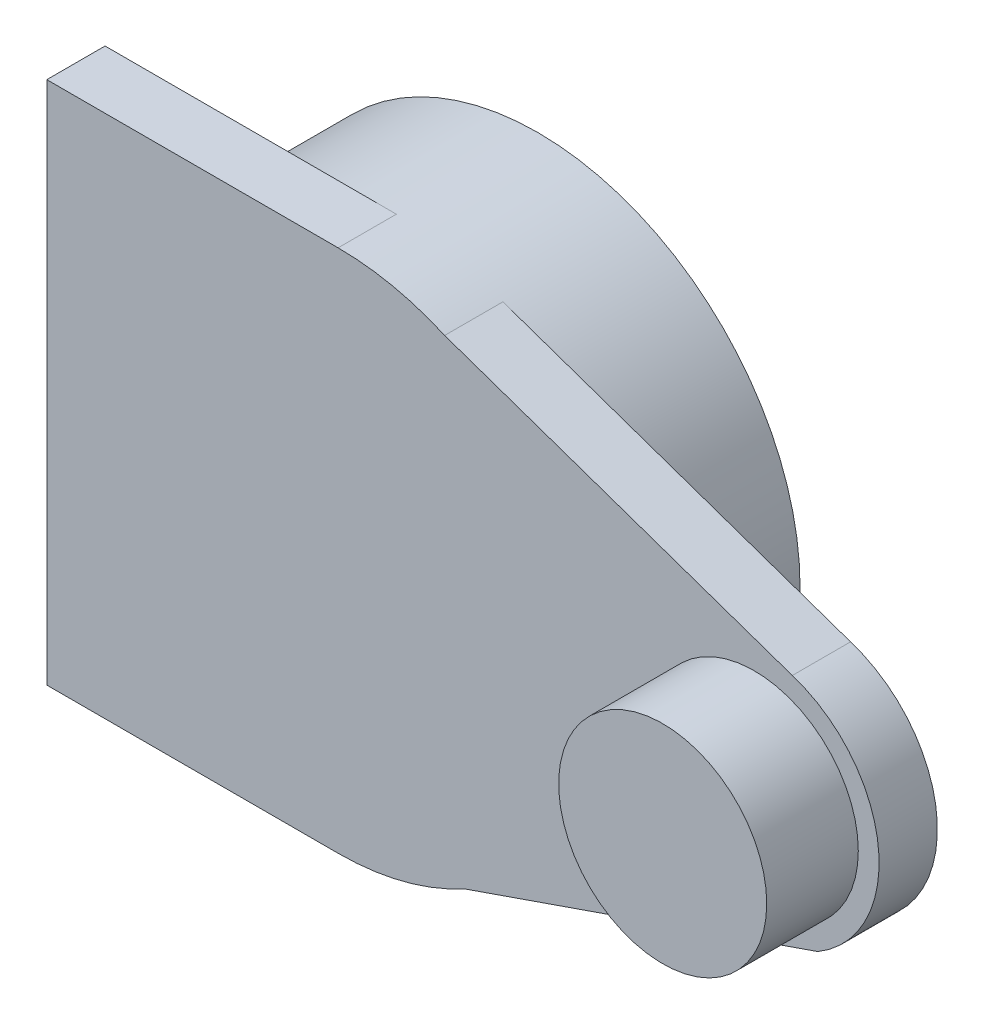
ISO-10303-21;
HEADER;
FILE_DESCRIPTION(('STEP AP214'),'2;1');
FILE_NAME('part.step','',(''),(''),'','','');
FILE_SCHEMA(('AUTOMOTIVE_DESIGN { 1 0 10303 214 1 1 1 1 }'));
ENDSEC;
DATA;
#1=APPLICATION_CONTEXT('core data for automotive mechanical design processes');
#2=APPLICATION_PROTOCOL_DEFINITION('international standard','automotive_design',2000,#1);
#3=PRODUCT_CONTEXT('',#1,'mechanical');
#4=PRODUCT('Part','Part','',(#3));
#5=PRODUCT_RELATED_PRODUCT_CATEGORY('part','',(#4));
#6=PRODUCT_DEFINITION_FORMATION('','',#4);
#7=PRODUCT_DEFINITION_CONTEXT('part definition',#1,'design');
#8=PRODUCT_DEFINITION('design','',#6,#7);
#9=PRODUCT_DEFINITION_SHAPE('','',#8);
#10=(LENGTH_UNIT() NAMED_UNIT(*) SI_UNIT(.MILLI.,.METRE.));
#11=(NAMED_UNIT(*) PLANE_ANGLE_UNIT() SI_UNIT($,.RADIAN.));
#12=(NAMED_UNIT(*) SI_UNIT($,.STERADIAN.) SOLID_ANGLE_UNIT());
#13=UNCERTAINTY_MEASURE_WITH_UNIT(LENGTH_MEASURE(1.E-05),#10,'distance_accuracy_value','');
#14=(GEOMETRIC_REPRESENTATION_CONTEXT(3) GLOBAL_UNCERTAINTY_ASSIGNED_CONTEXT((#13)) GLOBAL_UNIT_ASSIGNED_CONTEXT((#10,
#11,#12)) REPRESENTATION_CONTEXT('',''));
#15=CARTESIAN_POINT('',(0.,0.,0.));
#16=DIRECTION('',(0.,0.,1.));
#17=DIRECTION('',(1.,0.,0.));
#18=AXIS2_PLACEMENT_3D('',#15,#16,#17);
#19=CARTESIAN_POINT('',(0.,0.,17.));
#20=DIRECTION('',(0.,0.,-1.));
#21=DIRECTION('',(-1.,0.,0.));
#22=AXIS2_PLACEMENT_3D('',#19,#20,#21);
#23=CYLINDRICAL_SURFACE('',#22,31.5);
#24=CARTESIAN_POINT('',(0.,0.,17.));
#25=DIRECTION('',(0.,0.,1.));
#26=DIRECTION('',(1.,0.,0.));
#27=AXIS2_PLACEMENT_3D('',#24,#25,#26);
#28=CIRCLE('',#27,31.5);
#29=CARTESIAN_POINT('',(0.,31.5,17.));
#30=VERTEX_POINT('',#29);
#31=CARTESIAN_POINT('',(0.,-31.5,17.));
#32=VERTEX_POINT('',#31);
#33=EDGE_CURVE('E11',#30,#32,#28,.T.);
#34=ORIENTED_EDGE('',*,*,#33,.F.);
#35=DIRECTION('',(0.,0.,-1.));
#36=VECTOR('',#35,1.);
#37=CARTESIAN_POINT('',(0.,31.5,24.));
#38=LINE('',#37,#36);
#39=CARTESIAN_POINT('',(0.,31.5,24.));
#40=VERTEX_POINT('',#39);
#41=EDGE_CURVE('E151',#40,#30,#38,.T.);
#42=ORIENTED_EDGE('',*,*,#41,.F.);
#43=CARTESIAN_POINT('',(0.,0.,24.));
#44=DIRECTION('',(0.,0.,1.));
#45=DIRECTION('',(1.,0.,0.));
#46=AXIS2_PLACEMENT_3D('',#43,#44,#45);
#47=CIRCLE('',#46,31.5);
#48=CARTESIAN_POINT('',(12.8013934156946,28.7814927795035,24.));
#49=VERTEX_POINT('',#48);
#50=EDGE_CURVE('E130',#49,#40,#47,.T.);
#51=ORIENTED_EDGE('',*,*,#50,.F.);
#52=DIRECTION('',(0.,0.,-1.));
#53=VECTOR('',#52,1.);
#54=CARTESIAN_POINT('',(12.8013934156946,28.7814927795035,24.));
#55=LINE('',#54,#53);
#56=CARTESIAN_POINT('',(12.8013934156946,28.7814927795035,17.));
#57=VERTEX_POINT('',#56);
#58=EDGE_CURVE('E154',#49,#57,#55,.T.);
#59=ORIENTED_EDGE('',*,*,#58,.T.);
#60=CARTESIAN_POINT('',(15.1228498735212,-27.6323978637928,17.));
#61=VERTEX_POINT('',#60);
#62=EDGE_CURVE('E42',#61,#57,#28,.T.);
#63=ORIENTED_EDGE('',*,*,#62,.F.);
#64=DIRECTION('',(0.,0.,-1.));
#65=VECTOR('',#64,1.);
#66=CARTESIAN_POINT('',(15.1228498735212,-27.6323978637928,24.));
#67=LINE('',#66,#65);
#68=CARTESIAN_POINT('',(15.1228498735212,-27.6323978637928,24.));
#69=VERTEX_POINT('',#68);
#70=EDGE_CURVE('E161',#69,#61,#67,.T.);
#71=ORIENTED_EDGE('',*,*,#70,.F.);
#72=CARTESIAN_POINT('',(0.,-31.5,24.));
#73=VERTEX_POINT('',#72);
#74=EDGE_CURVE('E115',#73,#69,#47,.T.);
#75=ORIENTED_EDGE('',*,*,#74,.F.);
#76=DIRECTION('',(0.,0.,-1.));
#77=VECTOR('',#76,1.);
#78=CARTESIAN_POINT('',(0.,-31.5,24.));
#79=LINE('',#78,#77);
#80=EDGE_CURVE('E107',#73,#32,#79,.T.);
#81=ORIENTED_EDGE('',*,*,#80,.T.);
#82=EDGE_LOOP('',(#34,#42,#51,#59,#63,#71,#75,#81));
#83=FACE_BOUND('',#82,.T.);
#84=CARTESIAN_POINT('',(0.,0.,0.));
#85=DIRECTION('',(0.,0.,1.));
#86=DIRECTION('',(1.,0.,0.));
#87=AXIS2_PLACEMENT_3D('',#84,#85,#86);
#88=CIRCLE('',#87,31.5);
#89=CARTESIAN_POINT('',(31.5,0.,0.));
#90=VERTEX_POINT('',#89);
#91=EDGE_CURVE('E37',#90,#90,#88,.T.);
#92=ORIENTED_EDGE('',*,*,#91,.T.);
#93=EDGE_LOOP('',(#92));
#94=FACE_BOUND('',#93,.T.);
#95=ADVANCED_FACE('F34',(#83,#94),#23,.T.);
#96=CARTESIAN_POINT('',(0.,0.,0.));
#97=DIRECTION('',(0.,0.,1.));
#98=DIRECTION('',(1.,0.,0.));
#99=AXIS2_PLACEMENT_3D('',#96,#97,#98);
#100=PLANE('',#99);
#101=ORIENTED_EDGE('',*,*,#91,.F.);
#102=EDGE_LOOP('',(#101));
#103=FACE_BOUND('',#102,.T.);
#104=ADVANCED_FACE('F169',(#103),#100,.F.);
#105=CARTESIAN_POINT('',(0.,0.,17.));
#106=DIRECTION('',(0.,0.,1.));
#107=DIRECTION('',(1.,0.,0.));
#108=AXIS2_PLACEMENT_3D('',#105,#106,#107);
#109=PLANE('',#108);
#110=DIRECTION('',(1.,0.,0.));
#111=VECTOR('',#110,1.);
#112=CARTESIAN_POINT('',(0.,31.5,17.));
#113=LINE('',#112,#111);
#114=CARTESIAN_POINT('',(-35.,31.5,17.));
#115=VERTEX_POINT('',#114);
#116=EDGE_CURVE('E120',#115,#30,#113,.T.);
#117=ORIENTED_EDGE('',*,*,#116,.T.);
#118=ORIENTED_EDGE('',*,*,#33,.T.);
#119=DIRECTION('',(1.,0.,0.));
#120=VECTOR('',#119,1.);
#121=CARTESIAN_POINT('',(0.,-31.5,17.));
#122=LINE('',#121,#120);
#123=CARTESIAN_POINT('',(-35.,-31.5,17.));
#124=VERTEX_POINT('',#123);
#125=EDGE_CURVE('E140',#124,#32,#122,.T.);
#126=ORIENTED_EDGE('',*,*,#125,.F.);
#127=DIRECTION('',(0.,1.,0.));
#128=VECTOR('',#127,1.);
#129=CARTESIAN_POINT('',(-35.,0.,17.));
#130=LINE('',#129,#128);
#131=EDGE_CURVE('E105',#124,#115,#130,.T.);
#132=ORIENTED_EDGE('',*,*,#131,.T.);
#133=EDGE_LOOP('',(#117,#118,#126,#132));
#134=FACE_BOUND('',#133,.T.);
#135=ADVANCED_FACE('F171',(#134),#109,.F.);
#136=DIRECTION('',(0.944935564811964,0.327256441271207,0.));
#137=VECTOR('',#136,1.);
#138=CARTESIAN_POINT('',(10.164547599609,-29.3495904611847,17.));
#139=LINE('',#138,#137);
#140=CARTESIAN_POINT('',(57.6439366912385,-12.9062090429505,17.));
#141=VERTEX_POINT('',#140);
#142=EDGE_CURVE('E143',#61,#141,#139,.T.);
#143=ORIENTED_EDGE('',*,*,#142,.F.);
#144=ORIENTED_EDGE('',*,*,#62,.T.);
#145=DIRECTION('',(0.944732313874652,-0.327842729248412,0.));
#146=VECTOR('',#145,1.);
#147=CARTESIAN_POINT('',(10.2902128491951,29.6529272360854,17.));
#148=LINE('',#147,#146);
#149=CARTESIAN_POINT('',(54.5696027128904,14.2870126704761,17.));
#150=VERTEX_POINT('',#149);
#151=EDGE_CURVE('E122',#57,#150,#148,.T.);
#152=ORIENTED_EDGE('',*,*,#151,.T.);
#153=CARTESIAN_POINT('',(50.,0.,17.));
#154=DIRECTION('',(0.,0.,1.));
#155=DIRECTION('',(1.,0.,0.));
#156=AXIS2_PLACEMENT_3D('',#153,#154,#155);
#157=CIRCLE('',#156,15.);
#158=EDGE_CURVE('E145',#141,#150,#157,.T.);
#159=ORIENTED_EDGE('',*,*,#158,.F.);
#160=EDGE_LOOP('',(#143,#144,#152,#159));
#161=FACE_BOUND('',#160,.T.);
#162=ADVANCED_FACE('F176',(#161),#109,.F.);
#163=CARTESIAN_POINT('',(-35.,0.,24.));
#164=DIRECTION('',(-1.,0.,0.));
#165=DIRECTION('',(0.,0.,1.));
#166=AXIS2_PLACEMENT_3D('',#163,#164,#165);
#167=PLANE('',#166);
#168=ORIENTED_EDGE('',*,*,#131,.F.);
#169=DIRECTION('',(0.,0.,-1.));
#170=VECTOR('',#169,1.);
#171=CARTESIAN_POINT('',(-35.,-31.5,24.));
#172=LINE('',#171,#170);
#173=CARTESIAN_POINT('',(-35.,-31.5,24.));
#174=VERTEX_POINT('',#173);
#175=EDGE_CURVE('E98',#174,#124,#172,.T.);
#176=ORIENTED_EDGE('',*,*,#175,.F.);
#177=DIRECTION('',(0.,1.,0.));
#178=VECTOR('',#177,1.);
#179=CARTESIAN_POINT('',(-35.,0.,24.));
#180=LINE('',#179,#178);
#181=CARTESIAN_POINT('',(-35.,31.5,24.));
#182=VERTEX_POINT('',#181);
#183=EDGE_CURVE('E102',#174,#182,#180,.T.);
#184=ORIENTED_EDGE('',*,*,#183,.T.);
#185=DIRECTION('',(0.,0.,-1.));
#186=VECTOR('',#185,1.);
#187=CARTESIAN_POINT('',(-35.,31.5,24.));
#188=LINE('',#187,#186);
#189=EDGE_CURVE('E138',#182,#115,#188,.T.);
#190=ORIENTED_EDGE('',*,*,#189,.T.);
#191=EDGE_LOOP('',(#168,#176,#184,#190));
#192=FACE_BOUND('',#191,.T.);
#193=ADVANCED_FACE('F100',(#192),#167,.T.);
#194=CARTESIAN_POINT('',(0.,-31.5,24.));
#195=DIRECTION('',(0.,1.,0.));
#196=DIRECTION('',(-1.,0.,0.));
#197=AXIS2_PLACEMENT_3D('',#194,#195,#196);
#198=PLANE('',#197);
#199=ORIENTED_EDGE('',*,*,#125,.T.);
#200=ORIENTED_EDGE('',*,*,#80,.F.);
#201=DIRECTION('',(1.,0.,0.));
#202=VECTOR('',#201,1.);
#203=CARTESIAN_POINT('',(0.,-31.5,24.));
#204=LINE('',#203,#202);
#205=EDGE_CURVE('E110',#174,#73,#204,.T.);
#206=ORIENTED_EDGE('',*,*,#205,.F.);
#207=ORIENTED_EDGE('',*,*,#175,.T.);
#208=EDGE_LOOP('',(#199,#200,#206,#207));
#209=FACE_BOUND('',#208,.T.);
#210=ADVANCED_FACE('F111',(#209),#198,.F.);
#211=CARTESIAN_POINT('',(10.164547599609,-29.3495904611847,24.));
#212=DIRECTION('',(-0.327256441271207,0.944935564811964,0.));
#213=DIRECTION('',(-0.944935564811964,-0.327256441271207,0.));
#214=AXIS2_PLACEMENT_3D('',#211,#212,#213);
#215=PLANE('',#214);
#216=ORIENTED_EDGE('',*,*,#142,.T.);
#217=DIRECTION('',(0.,0.,-1.));
#218=VECTOR('',#217,1.);
#219=CARTESIAN_POINT('',(57.6439366912385,-12.9062090429505,24.));
#220=LINE('',#219,#218);
#221=CARTESIAN_POINT('',(57.6439366912385,-12.9062090429505,24.));
#222=VERTEX_POINT('',#221);
#223=EDGE_CURVE('E158',#222,#141,#220,.T.);
#224=ORIENTED_EDGE('',*,*,#223,.F.);
#225=DIRECTION('',(0.944935564811964,0.327256441271207,0.));
#226=VECTOR('',#225,1.);
#227=CARTESIAN_POINT('',(10.164547599609,-29.3495904611847,24.));
#228=LINE('',#227,#226);
#229=EDGE_CURVE('E129',#69,#222,#228,.T.);
#230=ORIENTED_EDGE('',*,*,#229,.F.);
#231=ORIENTED_EDGE('',*,*,#70,.T.);
#232=EDGE_LOOP('',(#216,#224,#230,#231));
#233=FACE_BOUND('',#232,.T.);
#234=ADVANCED_FACE('F183',(#233),#215,.F.);
#235=CARTESIAN_POINT('',(50.,0.,24.));
#236=DIRECTION('',(0.,0.,-1.));
#237=DIRECTION('',(-1.,0.,0.));
#238=AXIS2_PLACEMENT_3D('',#235,#236,#237);
#239=CYLINDRICAL_SURFACE('',#238,15.);
#240=ORIENTED_EDGE('',*,*,#158,.T.);
#241=DIRECTION('',(0.,0.,-1.));
#242=VECTOR('',#241,1.);
#243=CARTESIAN_POINT('',(54.5696027128904,14.2870126704761,24.));
#244=LINE('',#243,#242);
#245=CARTESIAN_POINT('',(54.5696027128904,14.2870126704761,24.));
#246=VERTEX_POINT('',#245);
#247=EDGE_CURVE('E156',#246,#150,#244,.T.);
#248=ORIENTED_EDGE('',*,*,#247,.F.);
#249=CARTESIAN_POINT('',(50.,0.,24.));
#250=DIRECTION('',(0.,0.,1.));
#251=DIRECTION('',(1.,0.,0.));
#252=AXIS2_PLACEMENT_3D('',#249,#250,#251);
#253=CIRCLE('',#252,15.);
#254=EDGE_CURVE('E132',#222,#246,#253,.T.);
#255=ORIENTED_EDGE('',*,*,#254,.F.);
#256=ORIENTED_EDGE('',*,*,#223,.T.);
#257=EDGE_LOOP('',(#240,#248,#255,#256));
#258=FACE_BOUND('',#257,.T.);
#259=ADVANCED_FACE('F186',(#258),#239,.T.);
#260=CARTESIAN_POINT('',(10.2902128491951,29.6529272360854,24.));
#261=DIRECTION('',(0.327842729248412,0.944732313874651,0.));
#262=DIRECTION('',(-0.944732313874651,0.327842729248412,0.));
#263=AXIS2_PLACEMENT_3D('',#260,#261,#262);
#264=PLANE('',#263);
#265=ORIENTED_EDGE('',*,*,#151,.F.);
#266=ORIENTED_EDGE('',*,*,#58,.F.);
#267=DIRECTION('',(0.944732313874652,-0.327842729248412,0.));
#268=VECTOR('',#267,1.);
#269=CARTESIAN_POINT('',(10.2902128491951,29.6529272360854,24.));
#270=LINE('',#269,#268);
#271=EDGE_CURVE('E134',#49,#246,#270,.T.);
#272=ORIENTED_EDGE('',*,*,#271,.T.);
#273=ORIENTED_EDGE('',*,*,#247,.T.);
#274=EDGE_LOOP('',(#265,#266,#272,#273));
#275=FACE_BOUND('',#274,.T.);
#276=ADVANCED_FACE('F190',(#275),#264,.T.);
#277=CARTESIAN_POINT('',(0.,31.5,24.));
#278=DIRECTION('',(0.,1.,0.));
#279=DIRECTION('',(-1.,0.,0.));
#280=AXIS2_PLACEMENT_3D('',#277,#278,#279);
#281=PLANE('',#280);
#282=ORIENTED_EDGE('',*,*,#116,.F.);
#283=ORIENTED_EDGE('',*,*,#189,.F.);
#284=DIRECTION('',(1.,0.,0.));
#285=VECTOR('',#284,1.);
#286=CARTESIAN_POINT('',(0.,31.5,24.));
#287=LINE('',#286,#285);
#288=EDGE_CURVE('E119',#182,#40,#287,.T.);
#289=ORIENTED_EDGE('',*,*,#288,.T.);
#290=ORIENTED_EDGE('',*,*,#41,.T.);
#291=EDGE_LOOP('',(#282,#283,#289,#290));
#292=FACE_BOUND('',#291,.T.);
#293=ADVANCED_FACE('F194',(#292),#281,.T.);
#294=CARTESIAN_POINT('',(0.,0.,24.));
#295=DIRECTION('',(0.,0.,1.));
#296=DIRECTION('',(1.,0.,0.));
#297=AXIS2_PLACEMENT_3D('',#294,#295,#296);
#298=PLANE('',#297);
#299=CARTESIAN_POINT('',(50.,0.,24.));
#300=DIRECTION('',(0.,0.,1.));
#301=DIRECTION('',(1.,0.,0.));
#302=AXIS2_PLACEMENT_3D('',#299,#300,#301);
#303=CIRCLE('',#302,12.5);
#304=CARTESIAN_POINT('',(62.5,0.,24.));
#305=VERTEX_POINT('',#304);
#306=EDGE_CURVE('E125',#305,#305,#303,.T.);
#307=ORIENTED_EDGE('',*,*,#306,.F.);
#308=EDGE_LOOP('',(#307));
#309=FACE_BOUND('',#308,.T.);
#310=ORIENTED_EDGE('',*,*,#183,.F.);
#311=ORIENTED_EDGE('',*,*,#205,.T.);
#312=ORIENTED_EDGE('',*,*,#74,.T.);
#313=ORIENTED_EDGE('',*,*,#229,.T.);
#314=ORIENTED_EDGE('',*,*,#254,.T.);
#315=ORIENTED_EDGE('',*,*,#271,.F.);
#316=ORIENTED_EDGE('',*,*,#50,.T.);
#317=ORIENTED_EDGE('',*,*,#288,.F.);
#318=EDGE_LOOP('',(#310,#311,#312,#313,#314,#315,#316,#317));
#319=FACE_BOUND('',#318,.T.);
#320=ADVANCED_FACE('F117',(#309,#319),#298,.T.);
#321=CARTESIAN_POINT('',(50.,0.,35.));
#322=DIRECTION('',(0.,0.,-1.));
#323=DIRECTION('',(-1.,0.,0.));
#324=AXIS2_PLACEMENT_3D('',#321,#322,#323);
#325=CYLINDRICAL_SURFACE('',#324,12.5);
#326=CARTESIAN_POINT('',(50.,0.,35.));
#327=DIRECTION('',(0.,0.,1.));
#328=DIRECTION('',(1.,0.,0.));
#329=AXIS2_PLACEMENT_3D('',#326,#327,#328);
#330=CIRCLE('',#329,12.5);
#331=CARTESIAN_POINT('',(62.5,0.,35.));
#332=VERTEX_POINT('',#331);
#333=EDGE_CURVE('E141',#332,#332,#330,.T.);
#334=ORIENTED_EDGE('',*,*,#333,.F.);
#335=EDGE_LOOP('',(#334));
#336=FACE_BOUND('',#335,.T.);
#337=ORIENTED_EDGE('',*,*,#306,.T.);
#338=EDGE_LOOP('',(#337));
#339=FACE_BOUND('',#338,.T.);
#340=ADVANCED_FACE('F201',(#336,#339),#325,.T.);
#341=CARTESIAN_POINT('',(50.,0.,35.));
#342=DIRECTION('',(0.,0.,1.));
#343=DIRECTION('',(1.,0.,0.));
#344=AXIS2_PLACEMENT_3D('',#341,#342,#343);
#345=PLANE('',#344);
#346=ORIENTED_EDGE('',*,*,#333,.T.);
#347=EDGE_LOOP('',(#346));
#348=FACE_BOUND('',#347,.T.);
#349=ADVANCED_FACE('F205',(#348),#345,.T.);
#350=CLOSED_SHELL('',(#95,#104,#135,#162,#193,#210,#234,#259,#276,#293,#320,#340,#349));
#351=MANIFOLD_SOLID_BREP('B2',#350);
#352=ADVANCED_BREP_SHAPE_REPRESENTATION('',(#18,#351),#14);
#353=SHAPE_DEFINITION_REPRESENTATION(#9,#352);
ENDSEC;
END-ISO-10303-21;
